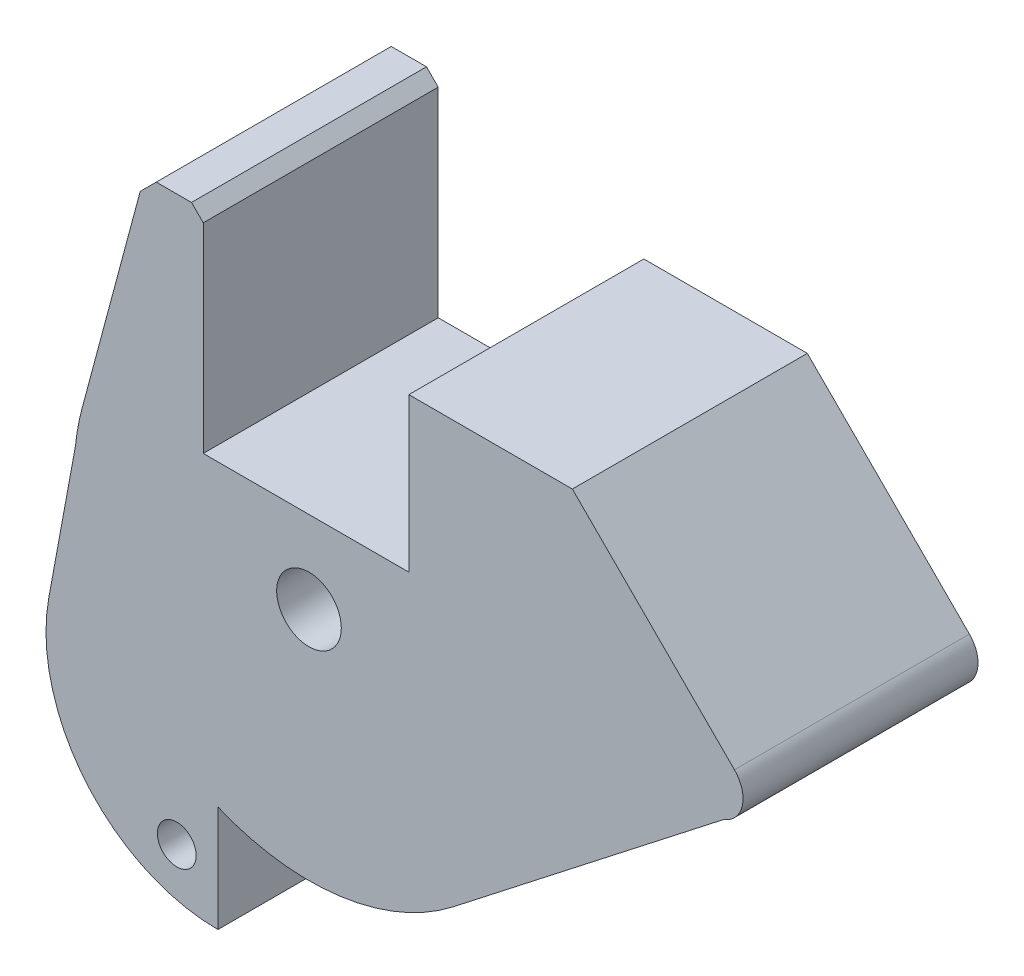
ISO-10303-21;
HEADER;
FILE_DESCRIPTION(('STEP AP214'),'2;1');
FILE_NAME('part.step','',(''),(''),'','','');
FILE_SCHEMA(('AUTOMOTIVE_DESIGN { 1 0 10303 214 1 1 1 1 }'));
ENDSEC;
DATA;
#1=APPLICATION_CONTEXT('core data for automotive mechanical design processes');
#2=APPLICATION_PROTOCOL_DEFINITION('international standard','automotive_design',2000,#1);
#3=PRODUCT_CONTEXT('',#1,'mechanical');
#4=PRODUCT('Part','Part','',(#3));
#5=PRODUCT_RELATED_PRODUCT_CATEGORY('part','',(#4));
#6=PRODUCT_DEFINITION_FORMATION('','',#4);
#7=PRODUCT_DEFINITION_CONTEXT('part definition',#1,'design');
#8=PRODUCT_DEFINITION('design','',#6,#7);
#9=PRODUCT_DEFINITION_SHAPE('','',#8);
#10=(LENGTH_UNIT() NAMED_UNIT(*) SI_UNIT(.MILLI.,.METRE.));
#11=(NAMED_UNIT(*) PLANE_ANGLE_UNIT() SI_UNIT($,.RADIAN.));
#12=(NAMED_UNIT(*) SI_UNIT($,.STERADIAN.) SOLID_ANGLE_UNIT());
#13=UNCERTAINTY_MEASURE_WITH_UNIT(LENGTH_MEASURE(1.E-05),#10,'distance_accuracy_value','');
#14=(GEOMETRIC_REPRESENTATION_CONTEXT(3) GLOBAL_UNCERTAINTY_ASSIGNED_CONTEXT((#13)) GLOBAL_UNIT_ASSIGNED_CONTEXT((#10,
#11,#12)) REPRESENTATION_CONTEXT('',''));
#15=CARTESIAN_POINT('',(0.,0.,0.));
#16=DIRECTION('',(0.,0.,1.));
#17=DIRECTION('',(1.,0.,0.));
#18=AXIS2_PLACEMENT_3D('',#15,#16,#17);
#19=CARTESIAN_POINT('',(21.2910496328162,-22.7691994030098,20.));
#20=DIRECTION('',(-0.614754191847409,0.78871876077981,0.));
#21=DIRECTION('',(-0.78871876077981,-0.614754191847409,0.));
#22=AXIS2_PLACEMENT_3D('',#19,#20,#21);
#23=PLANE('',#22);
#24=DIRECTION('',(0.78871876077981,0.614754191847409,0.));
#25=VECTOR('',#24,1.);
#26=CARTESIAN_POINT('',(21.2910496328162,-22.7691994030098,20.));
#27=LINE('',#26,#25);
#28=CARTESIAN_POINT('',(21.2910496328162,-22.7691994030098,20.));
#29=VERTEX_POINT('',#28);
#30=CARTESIAN_POINT('',(44.3198051533948,-4.81980515339445,20.));
#31=VERTEX_POINT('',#30);
#32=EDGE_CURVE('E214',#29,#31,#27,.T.);
#33=ORIENTED_EDGE('',*,*,#32,.F.);
#34=DIRECTION('',(0.,0.,-1.));
#35=VECTOR('',#34,1.);
#36=CARTESIAN_POINT('',(21.2910496328162,-22.7691994030098,20.));
#37=LINE('',#36,#35);
#38=CARTESIAN_POINT('',(21.2910496328162,-22.7691994030098,0.));
#39=VERTEX_POINT('',#38);
#40=EDGE_CURVE('E247',#29,#39,#37,.T.);
#41=ORIENTED_EDGE('',*,*,#40,.T.);
#42=DIRECTION('',(0.78871876077981,0.614754191847409,0.));
#43=VECTOR('',#42,1.);
#44=CARTESIAN_POINT('',(21.2910496328162,-22.7691994030098,0.));
#45=LINE('',#44,#43);
#46=CARTESIAN_POINT('',(44.3198051533948,-4.81980515339445,0.));
#47=VERTEX_POINT('',#46);
#48=EDGE_CURVE('E235',#39,#47,#45,.T.);
#49=ORIENTED_EDGE('',*,*,#48,.T.);
#50=DIRECTION('',(0.,0.,-1.));
#51=VECTOR('',#50,1.);
#52=CARTESIAN_POINT('',(44.3198051533948,-4.81980515339445,20.));
#53=LINE('',#52,#51);
#54=EDGE_CURVE('E244',#31,#47,#53,.T.);
#55=ORIENTED_EDGE('',*,*,#54,.F.);
#56=EDGE_LOOP('',(#33,#41,#49,#55));
#57=FACE_BOUND('',#56,.T.);
#58=ADVANCED_FACE('F38',(#57),#23,.F.);
#59=CARTESIAN_POINT('',(9.,-7.,20.));
#60=DIRECTION('',(0.,0.,1.));
#61=DIRECTION('',(1.,0.,0.));
#62=AXIS2_PLACEMENT_3D('',#59,#60,#61);
#63=PLANE('',#62);
#64=CARTESIAN_POINT('',(9.,-7.,20.));
#65=DIRECTION('',(0.,0.,1.));
#66=DIRECTION('',(-1.,0.,0.));
#67=AXIS2_PLACEMENT_3D('',#64,#65,#66);
#68=CIRCLE('',#67,19.9934376956099);
#69=CARTESIAN_POINT('',(1.24694692981227,-25.4289912631996,20.));
#70=VERTEX_POINT('',#69);
#71=EDGE_CURVE('E156',#70,#29,#68,.T.);
#72=ORIENTED_EDGE('',*,*,#71,.T.);
#73=ORIENTED_EDGE('',*,*,#32,.T.);
#74=CARTESIAN_POINT('',(43.4430525681645,-2.47858647409688,20.));
#75=DIRECTION('',(0.,0.,1.));
#76=DIRECTION('',(1.,0.,0.));
#77=AXIS2_PLACEMENT_3D('',#74,#75,#76);
#78=CIRCLE('',#77,2.5);
#79=CARTESIAN_POINT('',(45.2108195211308,-0.710819521130502,20.));
#80=VERTEX_POINT('',#79);
#81=EDGE_CURVE('E11',#31,#80,#78,.T.);
#82=ORIENTED_EDGE('',*,*,#81,.T.);
#83=DIRECTION('',(-0.707106781186551,0.707106781186544,0.));
#84=VECTOR('',#83,1.);
#85=CARTESIAN_POINT('',(49.3198051533948,-4.81980515339445,20.));
#86=LINE('',#85,#84);
#87=CARTESIAN_POINT('',(31.4154341487915,13.0845658512087,20.));
#88=VERTEX_POINT('',#87);
#89=EDGE_CURVE('E216',#80,#88,#86,.T.);
#90=ORIENTED_EDGE('',*,*,#89,.T.);
#91=DIRECTION('',(1.,0.,0.));
#92=VECTOR('',#91,1.);
#93=CARTESIAN_POINT('',(17.5,13.0845658512087,20.));
#94=LINE('',#93,#92);
#95=CARTESIAN_POINT('',(17.5,13.0845658512087,20.));
#96=VERTEX_POINT('',#95);
#97=EDGE_CURVE('E182',#96,#88,#94,.T.);
#98=ORIENTED_EDGE('',*,*,#97,.F.);
#99=DIRECTION('',(0.,-1.,0.));
#100=VECTOR('',#99,1.);
#101=CARTESIAN_POINT('',(17.5,27.,20.));
#102=LINE('',#101,#100);
#103=CARTESIAN_POINT('',(17.5,0.,20.));
#104=VERTEX_POINT('',#103);
#105=EDGE_CURVE('E219',#96,#104,#102,.T.);
#106=ORIENTED_EDGE('',*,*,#105,.T.);
#107=DIRECTION('',(-1.,0.,0.));
#108=VECTOR('',#107,1.);
#109=CARTESIAN_POINT('',(17.5,0.,20.));
#110=LINE('',#109,#108);
#111=CARTESIAN_POINT('',(0.,0.,20.));
#112=VERTEX_POINT('',#111);
#113=EDGE_CURVE('E200',#104,#112,#110,.T.);
#114=ORIENTED_EDGE('',*,*,#113,.T.);
#115=DIRECTION('',(0.,1.,0.));
#116=VECTOR('',#115,1.);
#117=CARTESIAN_POINT('',(0.,0.,20.));
#118=LINE('',#117,#116);
#119=CARTESIAN_POINT('',(0.,17.,20.));
#120=VERTEX_POINT('',#119);
#121=EDGE_CURVE('E203',#112,#120,#118,.T.);
#122=ORIENTED_EDGE('',*,*,#121,.T.);
#123=DIRECTION('',(0.707106781186545,-0.70710678118655,0.));
#124=VECTOR('',#123,1.);
#125=CARTESIAN_POINT('',(16.5,0.499999999999909,20.));
#126=LINE('',#125,#124);
#127=CARTESIAN_POINT('',(-1.00000000000001,18.,20.));
#128=VERTEX_POINT('',#127);
#129=EDGE_CURVE('E267',#120,#128,#126,.F.);
#130=ORIENTED_EDGE('',*,*,#129,.T.);
#131=DIRECTION('',(-1.,0.,0.));
#132=VECTOR('',#131,1.);
#133=CARTESIAN_POINT('',(0.,18.,20.));
#134=LINE('',#133,#132);
#135=CARTESIAN_POINT('',(-4.,18.,20.));
#136=VERTEX_POINT('',#135);
#137=EDGE_CURVE('E207',#128,#136,#134,.T.);
#138=ORIENTED_EDGE('',*,*,#137,.T.);
#139=DIRECTION('',(0.707106781186549,0.707106781186546,0.));
#140=VECTOR('',#139,1.);
#141=CARTESIAN_POINT('',(-9.99999999999997,12.0000000000001,20.));
#142=LINE('',#141,#140);
#143=CARTESIAN_POINT('',(-5.36602540378443,16.6339745962156,20.));
#144=VERTEX_POINT('',#143);
#145=EDGE_CURVE('E269',#136,#144,#142,.F.);
#146=ORIENTED_EDGE('',*,*,#145,.T.);
#147=DIRECTION('',(-0.258819045102518,-0.965925826289069,0.));
#148=VECTOR('',#147,1.);
#149=CARTESIAN_POINT('',(-5.,18.,20.));
#150=LINE('',#149,#148);
#151=CARTESIAN_POINT('',(-10.312177826491,-1.82531754730556,20.));
#152=VERTEX_POINT('',#151);
#153=EDGE_CURVE('E210',#144,#152,#150,.T.);
#154=ORIENTED_EDGE('',*,*,#153,.T.);
#155=CARTESIAN_POINT('',(9.,-7.,20.));
#156=DIRECTION('',(0.,0.,1.));
#157=DIRECTION('',(1.,0.,0.));
#158=AXIS2_PLACEMENT_3D('',#155,#156,#157);
#159=CIRCLE('',#158,19.9934376956099);
#160=CARTESIAN_POINT('',(-10.8883884412208,-4.95315948365496,20.));
#161=VERTEX_POINT('',#160);
#162=EDGE_CURVE('E212',#152,#161,#159,.T.);
#163=ORIENTED_EDGE('',*,*,#162,.T.);
#164=DIRECTION('',(-0.181171310814724,-0.983451552511701,0.));
#165=VECTOR('',#164,1.);
#166=CARTESIAN_POINT('',(-9.64847808037758,1.77744131546159,20.));
#167=LINE('',#166,#165);
#168=CARTESIAN_POINT('',(-13.1426763635291,-17.1901022260393,20.));
#169=VERTEX_POINT('',#168);
#170=EDGE_CURVE('E171',#161,#169,#167,.T.);
#171=ORIENTED_EDGE('',*,*,#170,.T.);
#172=CARTESIAN_POINT('',(1.24694692981227,-19.8409566657182,20.));
#173=DIRECTION('',(0.,0.,1.));
#174=DIRECTION('',(1.,0.,0.));
#175=AXIS2_PLACEMENT_3D('',#172,#173,#174);
#176=CIRCLE('',#175,14.6317561415107);
#177=CARTESIAN_POINT('',(1.24694692981227,-34.4727128072289,20.));
#178=VERTEX_POINT('',#177);
#179=EDGE_CURVE('E163',#169,#178,#176,.T.);
#180=ORIENTED_EDGE('',*,*,#179,.T.);
#181=DIRECTION('',(0.,1.,0.));
#182=VECTOR('',#181,1.);
#183=CARTESIAN_POINT('',(1.24694692981227,-34.4727128072289,20.));
#184=LINE('',#183,#182);
#185=EDGE_CURVE('E149',#178,#70,#184,.T.);
#186=ORIENTED_EDGE('',*,*,#185,.T.);
#187=EDGE_LOOP('',(#72,#73,#82,#90,#98,#106,#114,#122,#130,#138,#146,#154,#163,#171,#180,#186));
#188=FACE_BOUND('',#187,.T.);
#189=CARTESIAN_POINT('',(-2.25305307018773,-29.9508520352143,20.));
#190=DIRECTION('',(0.,0.,-1.));
#191=DIRECTION('',(-1.,0.,0.));
#192=AXIS2_PLACEMENT_3D('',#189,#190,#191);
#193=CIRCLE('',#192,1.65);
#194=CARTESIAN_POINT('',(-3.90305307018773,-29.9508520352143,20.));
#195=VERTEX_POINT('',#194);
#196=EDGE_CURVE('E369',#195,#195,#193,.T.);
#197=ORIENTED_EDGE('',*,*,#196,.T.);
#198=EDGE_LOOP('',(#197));
#199=FACE_BOUND('',#198,.T.);
#200=CARTESIAN_POINT('',(9.,-7.,20.));
#201=DIRECTION('',(0.,0.,1.));
#202=DIRECTION('',(1.,0.,0.));
#203=AXIS2_PLACEMENT_3D('',#200,#201,#202);
#204=CIRCLE('',#203,2.75);
#205=CARTESIAN_POINT('',(11.75,-7.,20.));
#206=VERTEX_POINT('',#205);
#207=EDGE_CURVE('E194',#206,#206,#204,.T.);
#208=ORIENTED_EDGE('',*,*,#207,.F.);
#209=EDGE_LOOP('',(#208));
#210=FACE_BOUND('',#209,.T.);
#211=ADVANCED_FACE('F168',(#188,#199,#210),#63,.T.);
#212=CARTESIAN_POINT('',(9.,-7.,0.));
#213=DIRECTION('',(0.,0.,1.));
#214=DIRECTION('',(1.,0.,0.));
#215=AXIS2_PLACEMENT_3D('',#212,#213,#214);
#216=PLANE('',#215);
#217=DIRECTION('',(0.,-1.,0.));
#218=VECTOR('',#217,1.);
#219=CARTESIAN_POINT('',(17.5,27.,0.));
#220=LINE('',#219,#218);
#221=CARTESIAN_POINT('',(17.5,13.0845658512087,0.));
#222=VERTEX_POINT('',#221);
#223=CARTESIAN_POINT('',(17.5,0.,0.));
#224=VERTEX_POINT('',#223);
#225=EDGE_CURVE('E204',#222,#224,#220,.T.);
#226=ORIENTED_EDGE('',*,*,#225,.F.);
#227=DIRECTION('',(1.,0.,0.));
#228=VECTOR('',#227,1.);
#229=CARTESIAN_POINT('',(17.5,13.0845658512087,0.));
#230=LINE('',#229,#228);
#231=CARTESIAN_POINT('',(31.4154341487915,13.0845658512087,0.));
#232=VERTEX_POINT('',#231);
#233=EDGE_CURVE('E61',#222,#232,#230,.T.);
#234=ORIENTED_EDGE('',*,*,#233,.T.);
#235=DIRECTION('',(-0.707106781186551,0.707106781186544,0.));
#236=VECTOR('',#235,1.);
#237=CARTESIAN_POINT('',(49.3198051533948,-4.81980515339445,0.));
#238=LINE('',#237,#236);
#239=CARTESIAN_POINT('',(45.2108195211308,-0.710819521130502,0.));
#240=VERTEX_POINT('',#239);
#241=EDGE_CURVE('E238',#240,#232,#238,.T.);
#242=ORIENTED_EDGE('',*,*,#241,.F.);
#243=CARTESIAN_POINT('',(43.4430525681645,-2.47858647409688,0.));
#244=DIRECTION('',(0.,0.,1.));
#245=DIRECTION('',(1.,0.,0.));
#246=AXIS2_PLACEMENT_3D('',#243,#244,#245);
#247=CIRCLE('',#246,2.5);
#248=EDGE_CURVE('E273',#240,#47,#247,.F.);
#249=ORIENTED_EDGE('',*,*,#248,.T.);
#250=ORIENTED_EDGE('',*,*,#48,.F.);
#251=CARTESIAN_POINT('',(9.,-7.,0.));
#252=DIRECTION('',(0.,0.,1.));
#253=DIRECTION('',(1.,0.,0.));
#254=AXIS2_PLACEMENT_3D('',#251,#252,#253);
#255=CIRCLE('',#254,19.9934376956099);
#256=CARTESIAN_POINT('',(-10.312177826491,-1.82531754730556,0.));
#257=VERTEX_POINT('',#256);
#258=EDGE_CURVE('E232',#257,#39,#255,.T.);
#259=ORIENTED_EDGE('',*,*,#258,.F.);
#260=DIRECTION('',(-0.258819045102518,-0.965925826289069,0.));
#261=VECTOR('',#260,1.);
#262=CARTESIAN_POINT('',(-5.,18.,0.));
#263=LINE('',#262,#261);
#264=CARTESIAN_POINT('',(-5.36602540378443,16.6339745962156,0.));
#265=VERTEX_POINT('',#264);
#266=EDGE_CURVE('E230',#265,#257,#263,.T.);
#267=ORIENTED_EDGE('',*,*,#266,.F.);
#268=DIRECTION('',(-0.707106781186549,-0.707106781186546,0.));
#269=VECTOR('',#268,1.);
#270=CARTESIAN_POINT('',(-5.36602540378443,16.6339745962156,0.));
#271=LINE('',#270,#269);
#272=CARTESIAN_POINT('',(-4.,18.,0.));
#273=VERTEX_POINT('',#272);
#274=EDGE_CURVE('E260',#265,#273,#271,.F.);
#275=ORIENTED_EDGE('',*,*,#274,.T.);
#276=DIRECTION('',(-1.,0.,0.));
#277=VECTOR('',#276,1.);
#278=CARTESIAN_POINT('',(0.,18.,0.));
#279=LINE('',#278,#277);
#280=CARTESIAN_POINT('',(-1.00000000000001,18.,0.));
#281=VERTEX_POINT('',#280);
#282=EDGE_CURVE('E227',#281,#273,#279,.T.);
#283=ORIENTED_EDGE('',*,*,#282,.F.);
#284=DIRECTION('',(-0.707106781186545,0.70710678118655,0.));
#285=VECTOR('',#284,1.);
#286=CARTESIAN_POINT('',(-1.00000000000001,18.,0.));
#287=LINE('',#286,#285);
#288=CARTESIAN_POINT('',(0.,17.,0.));
#289=VERTEX_POINT('',#288);
#290=EDGE_CURVE('E258',#281,#289,#287,.F.);
#291=ORIENTED_EDGE('',*,*,#290,.T.);
#292=DIRECTION('',(0.,1.,0.));
#293=VECTOR('',#292,1.);
#294=CARTESIAN_POINT('',(0.,0.,0.));
#295=LINE('',#294,#293);
#296=CARTESIAN_POINT('',(0.,0.,0.));
#297=VERTEX_POINT('',#296);
#298=EDGE_CURVE('E224',#297,#289,#295,.T.);
#299=ORIENTED_EDGE('',*,*,#298,.F.);
#300=DIRECTION('',(-1.,0.,0.));
#301=VECTOR('',#300,1.);
#302=CARTESIAN_POINT('',(17.5,0.,0.));
#303=LINE('',#302,#301);
#304=EDGE_CURVE('E197',#224,#297,#303,.T.);
#305=ORIENTED_EDGE('',*,*,#304,.F.);
#306=EDGE_LOOP('',(#226,#234,#242,#249,#250,#259,#267,#275,#283,#291,#299,#305));
#307=FACE_BOUND('',#306,.T.);
#308=CARTESIAN_POINT('',(9.,-7.,0.));
#309=DIRECTION('',(0.,0.,1.));
#310=DIRECTION('',(1.,0.,0.));
#311=AXIS2_PLACEMENT_3D('',#308,#309,#310);
#312=CIRCLE('',#311,2.75);
#313=CARTESIAN_POINT('',(11.75,-7.,0.));
#314=VERTEX_POINT('',#313);
#315=EDGE_CURVE('E193',#314,#314,#312,.T.);
#316=ORIENTED_EDGE('',*,*,#315,.T.);
#317=EDGE_LOOP('',(#316));
#318=FACE_BOUND('',#317,.T.);
#319=ADVANCED_FACE('F284',(#307,#318),#216,.F.);
#320=CARTESIAN_POINT('',(17.5,0.,20.));
#321=DIRECTION('',(0.,-1.,0.));
#322=DIRECTION('',(0.,0.,-1.));
#323=AXIS2_PLACEMENT_3D('',#320,#321,#322);
#324=PLANE('',#323);
#325=ORIENTED_EDGE('',*,*,#304,.T.);
#326=DIRECTION('',(0.,0.,-1.));
#327=VECTOR('',#326,1.);
#328=CARTESIAN_POINT('',(0.,0.,20.));
#329=LINE('',#328,#327);
#330=EDGE_CURVE('E252',#112,#297,#329,.T.);
#331=ORIENTED_EDGE('',*,*,#330,.F.);
#332=ORIENTED_EDGE('',*,*,#113,.F.);
#333=DIRECTION('',(0.,0.,-1.));
#334=VECTOR('',#333,1.);
#335=CARTESIAN_POINT('',(17.5,0.,20.));
#336=LINE('',#335,#334);
#337=EDGE_CURVE('E221',#104,#224,#336,.T.);
#338=ORIENTED_EDGE('',*,*,#337,.T.);
#339=EDGE_LOOP('',(#325,#331,#332,#338));
#340=FACE_BOUND('',#339,.T.);
#341=ADVANCED_FACE('F294',(#340),#324,.F.);
#342=CARTESIAN_POINT('',(0.,0.,20.));
#343=DIRECTION('',(-1.,0.,0.));
#344=DIRECTION('',(0.,0.,1.));
#345=AXIS2_PLACEMENT_3D('',#342,#343,#344);
#346=PLANE('',#345);
#347=ORIENTED_EDGE('',*,*,#298,.T.);
#348=DIRECTION('',(0.,0.,1.));
#349=VECTOR('',#348,1.);
#350=CARTESIAN_POINT('',(0.,17.,20.));
#351=LINE('',#350,#349);
#352=EDGE_CURVE('E271',#289,#120,#351,.T.);
#353=ORIENTED_EDGE('',*,*,#352,.T.);
#354=ORIENTED_EDGE('',*,*,#121,.F.);
#355=ORIENTED_EDGE('',*,*,#330,.T.);
#356=EDGE_LOOP('',(#347,#353,#354,#355));
#357=FACE_BOUND('',#356,.T.);
#358=ADVANCED_FACE('F332',(#357),#346,.F.);
#359=CARTESIAN_POINT('',(0.,18.,20.));
#360=DIRECTION('',(0.,-1.,0.));
#361=DIRECTION('',(0.,0.,-1.));
#362=AXIS2_PLACEMENT_3D('',#359,#360,#361);
#363=PLANE('',#362);
#364=ORIENTED_EDGE('',*,*,#282,.T.);
#365=DIRECTION('',(0.,0.,1.));
#366=VECTOR('',#365,1.);
#367=CARTESIAN_POINT('',(-4.,18.,20.));
#368=LINE('',#367,#366);
#369=EDGE_CURVE('E265',#273,#136,#368,.T.);
#370=ORIENTED_EDGE('',*,*,#369,.T.);
#371=ORIENTED_EDGE('',*,*,#137,.F.);
#372=DIRECTION('',(0.,0.,-1.));
#373=VECTOR('',#372,1.);
#374=CARTESIAN_POINT('',(-1.00000000000001,18.,20.));
#375=LINE('',#374,#373);
#376=EDGE_CURVE('E262',#128,#281,#375,.T.);
#377=ORIENTED_EDGE('',*,*,#376,.T.);
#378=EDGE_LOOP('',(#364,#370,#371,#377));
#379=FACE_BOUND('',#378,.T.);
#380=ADVANCED_FACE('F328',(#379),#363,.F.);
#381=CARTESIAN_POINT('',(-5.,18.,20.));
#382=DIRECTION('',(0.965925826289069,-0.258819045102518,0.));
#383=DIRECTION('',(0.258819045102518,0.965925826289069,0.));
#384=AXIS2_PLACEMENT_3D('',#381,#382,#383);
#385=PLANE('',#384);
#386=ORIENTED_EDGE('',*,*,#153,.F.);
#387=DIRECTION('',(0.,0.,-1.));
#388=VECTOR('',#387,1.);
#389=CARTESIAN_POINT('',(-5.36602540378443,16.6339745962156,20.));
#390=LINE('',#389,#388);
#391=EDGE_CURVE('E255',#144,#265,#390,.T.);
#392=ORIENTED_EDGE('',*,*,#391,.T.);
#393=ORIENTED_EDGE('',*,*,#266,.T.);
#394=DIRECTION('',(0.,0.,-1.));
#395=VECTOR('',#394,1.);
#396=CARTESIAN_POINT('',(-10.312177826491,-1.82531754730556,20.));
#397=LINE('',#396,#395);
#398=EDGE_CURVE('E249',#152,#257,#397,.T.);
#399=ORIENTED_EDGE('',*,*,#398,.F.);
#400=EDGE_LOOP('',(#386,#392,#393,#399));
#401=FACE_BOUND('',#400,.T.);
#402=ADVANCED_FACE('F324',(#401),#385,.F.);
#403=CARTESIAN_POINT('',(9.,-7.,20.));
#404=DIRECTION('',(0.,0.,-1.));
#405=DIRECTION('',(-1.,0.,0.));
#406=AXIS2_PLACEMENT_3D('',#403,#404,#405);
#407=CYLINDRICAL_SURFACE('',#406,19.9934376956099);
#408=CARTESIAN_POINT('',(9.,-7.,10.));
#409=DIRECTION('',(0.,0.,1.));
#410=DIRECTION('',(1.,0.,0.));
#411=AXIS2_PLACEMENT_3D('',#408,#409,#410);
#412=CIRCLE('',#411,19.9934376956099);
#413=CARTESIAN_POINT('',(-10.8883884412208,-4.95315948365496,10.));
#414=VERTEX_POINT('',#413);
#415=CARTESIAN_POINT('',(1.24694692981227,-25.4289912631996,10.));
#416=VERTEX_POINT('',#415);
#417=EDGE_CURVE('E185',#414,#416,#412,.T.);
#418=ORIENTED_EDGE('',*,*,#417,.F.);
#419=DIRECTION('',(0.,0.,1.));
#420=VECTOR('',#419,1.);
#421=CARTESIAN_POINT('',(-10.8883884412208,-4.95315948365496,10.));
#422=LINE('',#421,#420);
#423=EDGE_CURVE('E179',#414,#161,#422,.T.);
#424=ORIENTED_EDGE('',*,*,#423,.T.);
#425=ORIENTED_EDGE('',*,*,#162,.F.);
#426=ORIENTED_EDGE('',*,*,#398,.T.);
#427=ORIENTED_EDGE('',*,*,#258,.T.);
#428=ORIENTED_EDGE('',*,*,#40,.F.);
#429=ORIENTED_EDGE('',*,*,#71,.F.);
#430=DIRECTION('',(0.,0.,-1.));
#431=VECTOR('',#430,1.);
#432=CARTESIAN_POINT('',(1.24694692981227,-25.4289912631996,20.));
#433=LINE('',#432,#431);
#434=EDGE_CURVE('E151',#70,#416,#433,.T.);
#435=ORIENTED_EDGE('',*,*,#434,.T.);
#436=EDGE_LOOP('',(#418,#424,#425,#426,#427,#428,#429,#435));
#437=FACE_BOUND('',#436,.T.);
#438=ADVANCED_FACE('F321',(#437),#407,.T.);
#439=CARTESIAN_POINT('',(49.3198051533948,-4.81980515339445,20.));
#440=DIRECTION('',(-0.707106781186544,-0.707106781186551,0.));
#441=DIRECTION('',(0.707106781186551,-0.707106781186544,0.));
#442=AXIS2_PLACEMENT_3D('',#439,#440,#441);
#443=PLANE('',#442);
#444=ORIENTED_EDGE('',*,*,#241,.T.);
#445=DIRECTION('',(0.,0.,1.));
#446=VECTOR('',#445,1.);
#447=CARTESIAN_POINT('',(31.4154341487915,13.0845658512087,20.));
#448=LINE('',#447,#446);
#449=EDGE_CURVE('E190',#232,#88,#448,.T.);
#450=ORIENTED_EDGE('',*,*,#449,.T.);
#451=ORIENTED_EDGE('',*,*,#89,.F.);
#452=DIRECTION('',(0.,0.,1.));
#453=VECTOR('',#452,1.);
#454=CARTESIAN_POINT('',(45.2108195211308,-0.7108195211305,20.));
#455=LINE('',#454,#453);
#456=EDGE_CURVE('E46',#80,#240,#455,.F.);
#457=ORIENTED_EDGE('',*,*,#456,.T.);
#458=EDGE_LOOP('',(#444,#450,#451,#457));
#459=FACE_BOUND('',#458,.T.);
#460=ADVANCED_FACE('F279',(#459),#443,.F.);
#461=CARTESIAN_POINT('',(17.5,27.,20.));
#462=DIRECTION('',(1.,0.,0.));
#463=DIRECTION('',(0.,0.,-1.));
#464=AXIS2_PLACEMENT_3D('',#461,#462,#463);
#465=PLANE('',#464);
#466=ORIENTED_EDGE('',*,*,#105,.F.);
#467=DIRECTION('',(0.,0.,1.));
#468=VECTOR('',#467,1.);
#469=CARTESIAN_POINT('',(17.5,13.0845658512087,0.));
#470=LINE('',#469,#468);
#471=EDGE_CURVE('E187',#222,#96,#470,.T.);
#472=ORIENTED_EDGE('',*,*,#471,.F.);
#473=ORIENTED_EDGE('',*,*,#225,.T.);
#474=ORIENTED_EDGE('',*,*,#337,.F.);
#475=EDGE_LOOP('',(#466,#472,#473,#474));
#476=FACE_BOUND('',#475,.T.);
#477=ADVANCED_FACE('F291',(#476),#465,.F.);
#478=CARTESIAN_POINT('',(9.,-7.,20.));
#479=DIRECTION('',(0.,0.,-1.));
#480=DIRECTION('',(-1.,0.,0.));
#481=AXIS2_PLACEMENT_3D('',#478,#479,#480);
#482=CYLINDRICAL_SURFACE('',#481,2.75);
#483=ORIENTED_EDGE('',*,*,#207,.T.);
#484=EDGE_LOOP('',(#483));
#485=FACE_BOUND('',#484,.T.);
#486=ORIENTED_EDGE('',*,*,#315,.F.);
#487=EDGE_LOOP('',(#486));
#488=FACE_BOUND('',#487,.T.);
#489=ADVANCED_FACE('F341',(#485,#488),#482,.F.);
#490=CARTESIAN_POINT('',(-5.36602540378443,16.6339745962156,20.));
#491=DIRECTION('',(0.707106781186546,-0.707106781186549,0.));
#492=DIRECTION('',(0.,0.,-1.));
#493=AXIS2_PLACEMENT_3D('',#490,#491,#492);
#494=PLANE('',#493);
#495=ORIENTED_EDGE('',*,*,#145,.F.);
#496=ORIENTED_EDGE('',*,*,#369,.F.);
#497=ORIENTED_EDGE('',*,*,#274,.F.);
#498=ORIENTED_EDGE('',*,*,#391,.F.);
#499=EDGE_LOOP('',(#495,#496,#497,#498));
#500=FACE_BOUND('',#499,.T.);
#501=ADVANCED_FACE('F339',(#500),#494,.F.);
#502=CARTESIAN_POINT('',(-1.00000000000001,18.,20.));
#503=DIRECTION('',(-0.70710678118655,-0.707106781186545,0.));
#504=DIRECTION('',(0.,0.,-1.));
#505=AXIS2_PLACEMENT_3D('',#502,#503,#504);
#506=PLANE('',#505);
#507=ORIENTED_EDGE('',*,*,#129,.F.);
#508=ORIENTED_EDGE('',*,*,#352,.F.);
#509=ORIENTED_EDGE('',*,*,#290,.F.);
#510=ORIENTED_EDGE('',*,*,#376,.F.);
#511=EDGE_LOOP('',(#507,#508,#509,#510));
#512=FACE_BOUND('',#511,.T.);
#513=ADVANCED_FACE('F308',(#512),#506,.F.);
#514=CARTESIAN_POINT('',(43.4430525681645,-2.47858647409688,20.));
#515=DIRECTION('',(0.,0.,1.));
#516=DIRECTION('',(1.,0.,0.));
#517=AXIS2_PLACEMENT_3D('',#514,#515,#516);
#518=CYLINDRICAL_SURFACE('',#517,2.5);
#519=ORIENTED_EDGE('',*,*,#81,.F.);
#520=ORIENTED_EDGE('',*,*,#54,.T.);
#521=ORIENTED_EDGE('',*,*,#248,.F.);
#522=ORIENTED_EDGE('',*,*,#456,.F.);
#523=EDGE_LOOP('',(#519,#520,#521,#522));
#524=FACE_BOUND('',#523,.T.);
#525=ADVANCED_FACE('F40',(#524),#518,.T.);
#526=CARTESIAN_POINT('',(17.5,13.0845658512087,0.));
#527=DIRECTION('',(0.,-1.,0.));
#528=DIRECTION('',(0.,0.,-1.));
#529=AXIS2_PLACEMENT_3D('',#526,#527,#528);
#530=PLANE('',#529);
#531=ORIENTED_EDGE('',*,*,#233,.F.);
#532=ORIENTED_EDGE('',*,*,#471,.T.);
#533=ORIENTED_EDGE('',*,*,#97,.T.);
#534=ORIENTED_EDGE('',*,*,#449,.F.);
#535=EDGE_LOOP('',(#531,#532,#533,#534));
#536=FACE_BOUND('',#535,.T.);
#537=ADVANCED_FACE('F298',(#536),#530,.F.);
#538=CARTESIAN_POINT('',(-9.64847808037758,1.77744131546159,10.));
#539=DIRECTION('',(-0.983451552511701,0.181171310814724,0.));
#540=DIRECTION('',(-0.181171310814724,-0.983451552511701,0.));
#541=AXIS2_PLACEMENT_3D('',#538,#539,#540);
#542=PLANE('',#541);
#543=ORIENTED_EDGE('',*,*,#170,.F.);
#544=ORIENTED_EDGE('',*,*,#423,.F.);
#545=DIRECTION('',(-0.181171310814724,-0.983451552511701,0.));
#546=VECTOR('',#545,1.);
#547=CARTESIAN_POINT('',(-9.64847808037758,1.77744131546159,10.));
#548=LINE('',#547,#546);
#549=CARTESIAN_POINT('',(-13.1426763635291,-17.1901022260393,10.));
#550=VERTEX_POINT('',#549);
#551=EDGE_CURVE('E172',#414,#550,#548,.T.);
#552=ORIENTED_EDGE('',*,*,#551,.T.);
#553=DIRECTION('',(0.,0.,1.));
#554=VECTOR('',#553,1.);
#555=CARTESIAN_POINT('',(-13.1426763635291,-17.1901022260393,10.));
#556=LINE('',#555,#554);
#557=EDGE_CURVE('E183',#550,#169,#556,.T.);
#558=ORIENTED_EDGE('',*,*,#557,.T.);
#559=EDGE_LOOP('',(#543,#544,#552,#558));
#560=FACE_BOUND('',#559,.T.);
#561=ADVANCED_FACE('F300',(#560),#542,.T.);
#562=CARTESIAN_POINT('',(1.24694692981227,-19.8409566657182,10.));
#563=DIRECTION('',(0.,0.,1.));
#564=DIRECTION('',(1.,0.,0.));
#565=AXIS2_PLACEMENT_3D('',#562,#563,#564);
#566=CYLINDRICAL_SURFACE('',#565,14.6317561415107);
#567=DIRECTION('',(0.,0.,-1.));
#568=VECTOR('',#567,1.);
#569=CARTESIAN_POINT('',(1.24694692981227,-34.4727128072289,20.));
#570=LINE('',#569,#568);
#571=CARTESIAN_POINT('',(1.24694692981227,-34.4727128072289,10.));
#572=VERTEX_POINT('',#571);
#573=EDGE_CURVE('E53',#178,#572,#570,.T.);
#574=ORIENTED_EDGE('',*,*,#573,.F.);
#575=ORIENTED_EDGE('',*,*,#179,.F.);
#576=ORIENTED_EDGE('',*,*,#557,.F.);
#577=CARTESIAN_POINT('',(1.24694692981227,-19.8409566657182,10.));
#578=DIRECTION('',(0.,0.,1.));
#579=DIRECTION('',(1.,0.,0.));
#580=AXIS2_PLACEMENT_3D('',#577,#578,#579);
#581=CIRCLE('',#580,14.6317561415107);
#582=EDGE_CURVE('E166',#550,#572,#581,.T.);
#583=ORIENTED_EDGE('',*,*,#582,.T.);
#584=EDGE_LOOP('',(#574,#575,#576,#583));
#585=FACE_BOUND('',#584,.T.);
#586=ADVANCED_FACE('F162',(#585),#566,.T.);
#587=CARTESIAN_POINT('',(0.,0.,10.));
#588=DIRECTION('',(0.,0.,1.));
#589=DIRECTION('',(1.,0.,0.));
#590=AXIS2_PLACEMENT_3D('',#587,#588,#589);
#591=PLANE('',#590);
#592=CARTESIAN_POINT('',(-2.25305307018773,-29.9508520352143,10.));
#593=DIRECTION('',(0.,0.,-1.));
#594=DIRECTION('',(-1.,0.,0.));
#595=AXIS2_PLACEMENT_3D('',#592,#593,#594);
#596=CIRCLE('',#595,1.65);
#597=CARTESIAN_POINT('',(-3.90305307018773,-29.9508520352143,10.));
#598=VERTEX_POINT('',#597);
#599=EDGE_CURVE('E366',#598,#598,#596,.T.);
#600=ORIENTED_EDGE('',*,*,#599,.F.);
#601=EDGE_LOOP('',(#600));
#602=FACE_BOUND('',#601,.T.);
#603=ORIENTED_EDGE('',*,*,#417,.T.);
#604=DIRECTION('',(0.,1.,0.));
#605=VECTOR('',#604,1.);
#606=CARTESIAN_POINT('',(1.24694692981227,-34.4727128072289,10.));
#607=LINE('',#606,#605);
#608=EDGE_CURVE('E157',#572,#416,#607,.T.);
#609=ORIENTED_EDGE('',*,*,#608,.F.);
#610=ORIENTED_EDGE('',*,*,#582,.F.);
#611=ORIENTED_EDGE('',*,*,#551,.F.);
#612=EDGE_LOOP('',(#603,#609,#610,#611));
#613=FACE_BOUND('',#612,.T.);
#614=ADVANCED_FACE('F363',(#602,#613),#591,.F.);
#615=CARTESIAN_POINT('',(-2.25305307018773,-29.9508520352143,20.));
#616=DIRECTION('',(0.,0.,-1.));
#617=DIRECTION('',(-1.,0.,0.));
#618=AXIS2_PLACEMENT_3D('',#615,#616,#617);
#619=CYLINDRICAL_SURFACE('',#618,1.65);
#620=ORIENTED_EDGE('',*,*,#196,.F.);
#621=EDGE_LOOP('',(#620));
#622=FACE_BOUND('',#621,.T.);
#623=ORIENTED_EDGE('',*,*,#599,.T.);
#624=EDGE_LOOP('',(#623));
#625=FACE_BOUND('',#624,.T.);
#626=ADVANCED_FACE('F378',(#622,#625),#619,.F.);
#627=CARTESIAN_POINT('',(1.24694692981227,-34.4727128072289,20.));
#628=DIRECTION('',(-1.,0.,0.));
#629=DIRECTION('',(0.,0.,1.));
#630=AXIS2_PLACEMENT_3D('',#627,#628,#629);
#631=PLANE('',#630);
#632=ORIENTED_EDGE('',*,*,#608,.T.);
#633=ORIENTED_EDGE('',*,*,#434,.F.);
#634=ORIENTED_EDGE('',*,*,#185,.F.);
#635=ORIENTED_EDGE('',*,*,#573,.T.);
#636=EDGE_LOOP('',(#632,#633,#634,#635));
#637=FACE_BOUND('',#636,.T.);
#638=ADVANCED_FACE('F150',(#637),#631,.F.);
#639=CLOSED_SHELL('',(#58,#211,#319,#341,#358,#380,#402,#438,#460,#477,#489,#501,#513,#525,#537,
#561,#586,#614,#626,#638));
#640=MANIFOLD_SOLID_BREP('B2',#639);
#641=ADVANCED_BREP_SHAPE_REPRESENTATION('',(#18,#640),#14);
#642=SHAPE_DEFINITION_REPRESENTATION(#9,#641);
ENDSEC;
END-ISO-10303-21;
